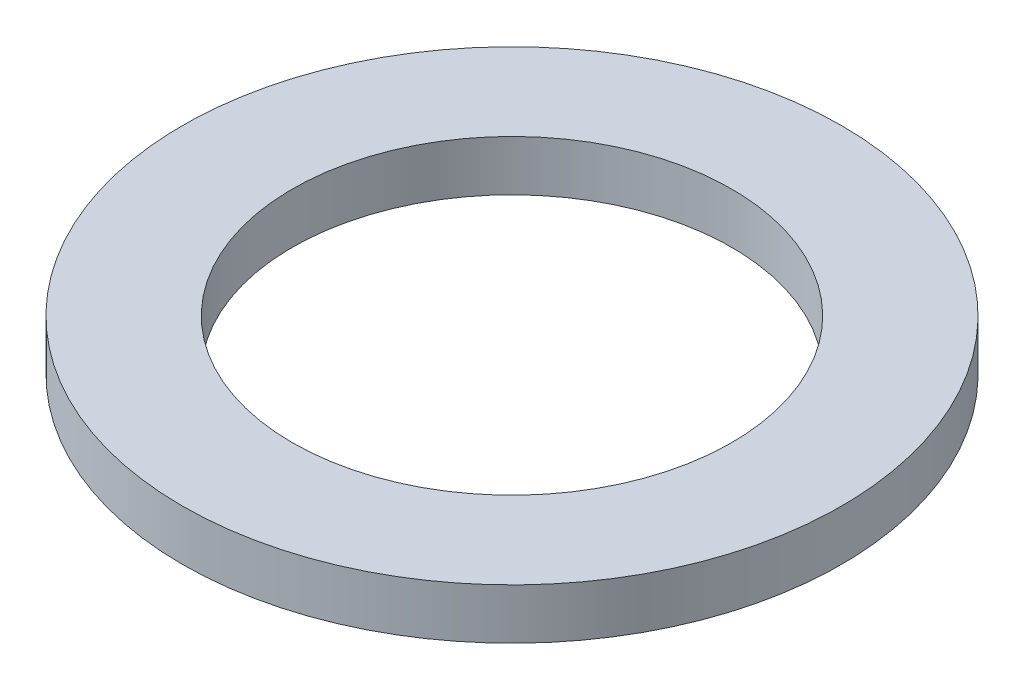
ISO-10303-21;
HEADER;
FILE_DESCRIPTION(('STEP AP214'),'2;1');
FILE_NAME('part.step','',(''),(''),'','','');
FILE_SCHEMA(('AUTOMOTIVE_DESIGN { 1 0 10303 214 1 1 1 1 }'));
ENDSEC;
DATA;
#1=APPLICATION_CONTEXT('core data for automotive mechanical design processes');
#2=APPLICATION_PROTOCOL_DEFINITION('international standard','automotive_design',2000,#1);
#3=PRODUCT_CONTEXT('',#1,'mechanical');
#4=PRODUCT('Part','Part','',(#3));
#5=PRODUCT_RELATED_PRODUCT_CATEGORY('part','',(#4));
#6=PRODUCT_DEFINITION_FORMATION('','',#4);
#7=PRODUCT_DEFINITION_CONTEXT('part definition',#1,'design');
#8=PRODUCT_DEFINITION('design','',#6,#7);
#9=PRODUCT_DEFINITION_SHAPE('','',#8);
#10=(LENGTH_UNIT() NAMED_UNIT(*) SI_UNIT(.MILLI.,.METRE.));
#11=(NAMED_UNIT(*) PLANE_ANGLE_UNIT() SI_UNIT($,.RADIAN.));
#12=(NAMED_UNIT(*) SI_UNIT($,.STERADIAN.) SOLID_ANGLE_UNIT());
#13=UNCERTAINTY_MEASURE_WITH_UNIT(LENGTH_MEASURE(1.E-05),#10,'distance_accuracy_value','');
#14=(GEOMETRIC_REPRESENTATION_CONTEXT(3) GLOBAL_UNCERTAINTY_ASSIGNED_CONTEXT((#13)) GLOBAL_UNIT_ASSIGNED_CONTEXT((#10,
#11,#12)) REPRESENTATION_CONTEXT('',''));
#15=CARTESIAN_POINT('',(0.,0.,0.));
#16=DIRECTION('',(0.,0.,1.));
#17=DIRECTION('',(1.,0.,0.));
#18=AXIS2_PLACEMENT_3D('',#15,#16,#17);
#19=CARTESIAN_POINT('',(0.,2.3,0.));
#20=DIRECTION('',(0.,1.,0.));
#21=DIRECTION('',(0.,0.,1.));
#22=AXIS2_PLACEMENT_3D('',#19,#20,#21);
#23=PLANE('',#22);
#24=CARTESIAN_POINT('',(0.,2.3,0.));
#25=DIRECTION('',(0.,1.,0.));
#26=DIRECTION('',(0.,0.,1.));
#27=AXIS2_PLACEMENT_3D('',#24,#25,#26);
#28=CIRCLE('',#27,15.);
#29=CARTESIAN_POINT('',(0.,2.3,15.));
#30=VERTEX_POINT('',#29);
#31=EDGE_CURVE('E10',#30,#30,#28,.T.);
#32=ORIENTED_EDGE('',*,*,#31,.T.);
#33=EDGE_LOOP('',(#32));
#34=FACE_BOUND('',#33,.T.);
#35=CARTESIAN_POINT('',(0.,2.3,0.));
#36=DIRECTION('',(0.,1.,0.));
#37=DIRECTION('',(0.,0.,1.));
#38=AXIS2_PLACEMENT_3D('',#35,#36,#37);
#39=CIRCLE('',#38,10.);
#40=CARTESIAN_POINT('',(0.,2.3,10.));
#41=VERTEX_POINT('',#40);
#42=EDGE_CURVE('E41',#41,#41,#39,.T.);
#43=ORIENTED_EDGE('',*,*,#42,.F.);
#44=EDGE_LOOP('',(#43));
#45=FACE_BOUND('',#44,.T.);
#46=ADVANCED_FACE('F30',(#34,#45),#23,.T.);
#47=CARTESIAN_POINT('',(0.,0.,0.));
#48=DIRECTION('',(0.,1.,0.));
#49=DIRECTION('',(0.,0.,1.));
#50=AXIS2_PLACEMENT_3D('',#47,#48,#49);
#51=PLANE('',#50);
#52=CARTESIAN_POINT('',(0.,0.,0.));
#53=DIRECTION('',(0.,1.,0.));
#54=DIRECTION('',(0.,0.,1.));
#55=AXIS2_PLACEMENT_3D('',#52,#53,#54);
#56=CIRCLE('',#55,15.);
#57=CARTESIAN_POINT('',(0.,0.,15.));
#58=VERTEX_POINT('',#57);
#59=EDGE_CURVE('E34',#58,#58,#56,.T.);
#60=ORIENTED_EDGE('',*,*,#59,.F.);
#61=EDGE_LOOP('',(#60));
#62=FACE_BOUND('',#61,.T.);
#63=CARTESIAN_POINT('',(0.,0.,0.));
#64=DIRECTION('',(0.,1.,0.));
#65=DIRECTION('',(0.,0.,1.));
#66=AXIS2_PLACEMENT_3D('',#63,#64,#65);
#67=CIRCLE('',#66,10.);
#68=CARTESIAN_POINT('',(0.,0.,10.));
#69=VERTEX_POINT('',#68);
#70=EDGE_CURVE('E43',#69,#69,#67,.T.);
#71=ORIENTED_EDGE('',*,*,#70,.T.);
#72=EDGE_LOOP('',(#71));
#73=FACE_BOUND('',#72,.T.);
#74=ADVANCED_FACE('F53',(#62,#73),#51,.F.);
#75=CARTESIAN_POINT('',(0.,2.3,0.));
#76=DIRECTION('',(0.,-1.,0.));
#77=DIRECTION('',(0.,0.,-1.));
#78=AXIS2_PLACEMENT_3D('',#75,#76,#77);
#79=CYLINDRICAL_SURFACE('',#78,15.);
#80=ORIENTED_EDGE('',*,*,#31,.F.);
#81=EDGE_LOOP('',(#80));
#82=FACE_BOUND('',#81,.T.);
#83=ORIENTED_EDGE('',*,*,#59,.T.);
#84=EDGE_LOOP('',(#83));
#85=FACE_BOUND('',#84,.T.);
#86=ADVANCED_FACE('F32',(#82,#85),#79,.T.);
#87=CARTESIAN_POINT('',(0.,2.3,0.));
#88=DIRECTION('',(0.,-1.,0.));
#89=DIRECTION('',(0.,0.,-1.));
#90=AXIS2_PLACEMENT_3D('',#87,#88,#89);
#91=CYLINDRICAL_SURFACE('',#90,10.);
#92=ORIENTED_EDGE('',*,*,#42,.T.);
#93=EDGE_LOOP('',(#92));
#94=FACE_BOUND('',#93,.T.);
#95=ORIENTED_EDGE('',*,*,#70,.F.);
#96=EDGE_LOOP('',(#95));
#97=FACE_BOUND('',#96,.T.);
#98=ADVANCED_FACE('F49',(#94,#97),#91,.F.);
#99=CLOSED_SHELL('',(#46,#74,#86,#98));
#100=MANIFOLD_SOLID_BREP('B2',#99);
#101=ADVANCED_BREP_SHAPE_REPRESENTATION('',(#18,#100),#14);
#102=SHAPE_DEFINITION_REPRESENTATION(#9,#101);
ENDSEC;
END-ISO-10303-21;
